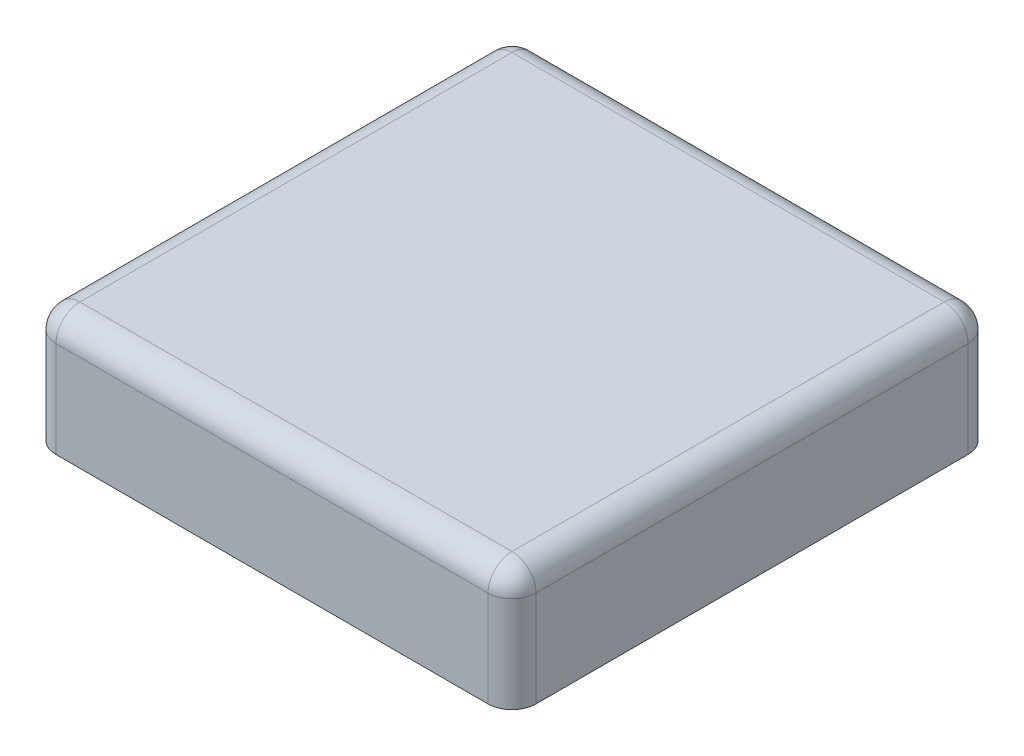
ISO-10303-21;
HEADER;
FILE_DESCRIPTION(('STEP AP214'),'2;1');
FILE_NAME('part.step','',(''),(''),'','','');
FILE_SCHEMA(('AUTOMOTIVE_DESIGN { 1 0 10303 214 1 1 1 1 }'));
ENDSEC;
DATA;
#1=APPLICATION_CONTEXT('core data for automotive mechanical design processes');
#2=APPLICATION_PROTOCOL_DEFINITION('international standard','automotive_design',2000,#1);
#3=PRODUCT_CONTEXT('',#1,'mechanical');
#4=PRODUCT('Part','Part','',(#3));
#5=PRODUCT_RELATED_PRODUCT_CATEGORY('part','',(#4));
#6=PRODUCT_DEFINITION_FORMATION('','',#4);
#7=PRODUCT_DEFINITION_CONTEXT('part definition',#1,'design');
#8=PRODUCT_DEFINITION('design','',#6,#7);
#9=PRODUCT_DEFINITION_SHAPE('','',#8);
#10=(LENGTH_UNIT() NAMED_UNIT(*) SI_UNIT(.MILLI.,.METRE.));
#11=(NAMED_UNIT(*) PLANE_ANGLE_UNIT() SI_UNIT($,.RADIAN.));
#12=(NAMED_UNIT(*) SI_UNIT($,.STERADIAN.) SOLID_ANGLE_UNIT());
#13=UNCERTAINTY_MEASURE_WITH_UNIT(LENGTH_MEASURE(1.E-05),#10,'distance_accuracy_value','');
#14=(GEOMETRIC_REPRESENTATION_CONTEXT(3) GLOBAL_UNCERTAINTY_ASSIGNED_CONTEXT((#13)) GLOBAL_UNIT_ASSIGNED_CONTEXT((#10,
#11,#12)) REPRESENTATION_CONTEXT('',''));
#15=CARTESIAN_POINT('',(0.,0.,0.));
#16=DIRECTION('',(0.,0.,1.));
#17=DIRECTION('',(1.,0.,0.));
#18=AXIS2_PLACEMENT_3D('',#15,#16,#17);
#19=CARTESIAN_POINT('',(30.,15.,-30.));
#20=DIRECTION('',(-1.,0.,0.));
#21=DIRECTION('',(0.,0.,1.));
#22=AXIS2_PLACEMENT_3D('',#19,#20,#21);
#23=PLANE('',#22);
#24=DIRECTION('',(0.,0.,-1.));
#25=VECTOR('',#24,1.);
#26=CARTESIAN_POINT('',(30.,0.,-30.));
#27=LINE('',#26,#25);
#28=CARTESIAN_POINT('',(30.,0.,27.));
#29=VERTEX_POINT('',#28);
#30=CARTESIAN_POINT('',(30.,0.,-27.));
#31=VERTEX_POINT('',#30);
#32=EDGE_CURVE('E194',#29,#31,#27,.T.);
#33=ORIENTED_EDGE('',*,*,#32,.T.);
#34=DIRECTION('',(0.,-1.,0.));
#35=VECTOR('',#34,1.);
#36=CARTESIAN_POINT('',(30.,15.,-27.));
#37=LINE('',#36,#35);
#38=CARTESIAN_POINT('',(30.,12.,-27.));
#39=VERTEX_POINT('',#38);
#40=EDGE_CURVE('E65',#31,#39,#37,.F.);
#41=ORIENTED_EDGE('',*,*,#40,.T.);
#42=DIRECTION('',(0.,0.,-1.));
#43=VECTOR('',#42,1.);
#44=CARTESIAN_POINT('',(30.,12.,30.));
#45=LINE('',#44,#43);
#46=CARTESIAN_POINT('',(30.,12.,27.));
#47=VERTEX_POINT('',#46);
#48=EDGE_CURVE('E253',#39,#47,#45,.F.);
#49=ORIENTED_EDGE('',*,*,#48,.T.);
#50=DIRECTION('',(0.,-1.,0.));
#51=VECTOR('',#50,1.);
#52=CARTESIAN_POINT('',(30.,15.,27.));
#53=LINE('',#52,#51);
#54=EDGE_CURVE('E250',#47,#29,#53,.T.);
#55=ORIENTED_EDGE('',*,*,#54,.T.);
#56=EDGE_LOOP('',(#33,#41,#49,#55));
#57=FACE_BOUND('',#56,.T.);
#58=ADVANCED_FACE('F39',(#57),#23,.F.);
#59=CARTESIAN_POINT('',(-30.,15.,-30.));
#60=DIRECTION('',(0.,0.,1.));
#61=DIRECTION('',(1.,0.,0.));
#62=AXIS2_PLACEMENT_3D('',#59,#60,#61);
#63=PLANE('',#62);
#64=DIRECTION('',(-1.,0.,0.));
#65=VECTOR('',#64,1.);
#66=CARTESIAN_POINT('',(30.,12.,-30.));
#67=LINE('',#66,#65);
#68=CARTESIAN_POINT('',(-27.,12.,-30.));
#69=VERTEX_POINT('',#68);
#70=CARTESIAN_POINT('',(27.,12.,-30.));
#71=VERTEX_POINT('',#70);
#72=EDGE_CURVE('E244',#69,#71,#67,.F.);
#73=ORIENTED_EDGE('',*,*,#72,.T.);
#74=DIRECTION('',(0.,-1.,0.));
#75=VECTOR('',#74,1.);
#76=CARTESIAN_POINT('',(27.,15.,-30.));
#77=LINE('',#76,#75);
#78=CARTESIAN_POINT('',(27.,0.,-30.));
#79=VERTEX_POINT('',#78);
#80=EDGE_CURVE('E247',#71,#79,#77,.T.);
#81=ORIENTED_EDGE('',*,*,#80,.T.);
#82=DIRECTION('',(-1.,0.,0.));
#83=VECTOR('',#82,1.);
#84=CARTESIAN_POINT('',(-30.,0.,-30.));
#85=LINE('',#84,#83);
#86=CARTESIAN_POINT('',(-27.,0.,-30.));
#87=VERTEX_POINT('',#86);
#88=EDGE_CURVE('E197',#79,#87,#85,.T.);
#89=ORIENTED_EDGE('',*,*,#88,.T.);
#90=DIRECTION('',(0.,-1.,0.));
#91=VECTOR('',#90,1.);
#92=CARTESIAN_POINT('',(-27.,15.,-30.));
#93=LINE('',#92,#91);
#94=EDGE_CURVE('E241',#87,#69,#93,.F.);
#95=ORIENTED_EDGE('',*,*,#94,.T.);
#96=EDGE_LOOP('',(#73,#81,#89,#95));
#97=FACE_BOUND('',#96,.T.);
#98=ADVANCED_FACE('F334',(#97),#63,.F.);
#99=CARTESIAN_POINT('',(-30.,15.,-30.));
#100=DIRECTION('',(1.,0.,0.));
#101=DIRECTION('',(0.,0.,-1.));
#102=AXIS2_PLACEMENT_3D('',#99,#100,#101);
#103=PLANE('',#102);
#104=DIRECTION('',(0.,0.,1.));
#105=VECTOR('',#104,1.);
#106=CARTESIAN_POINT('',(-30.,0.,-30.));
#107=LINE('',#106,#105);
#108=CARTESIAN_POINT('',(-30.,0.,-27.));
#109=VERTEX_POINT('',#108);
#110=CARTESIAN_POINT('',(-30.,0.,27.));
#111=VERTEX_POINT('',#110);
#112=EDGE_CURVE('E201',#109,#111,#107,.T.);
#113=ORIENTED_EDGE('',*,*,#112,.T.);
#114=DIRECTION('',(0.,-1.,0.));
#115=VECTOR('',#114,1.);
#116=CARTESIAN_POINT('',(-30.,15.,27.));
#117=LINE('',#116,#115);
#118=CARTESIAN_POINT('',(-30.,12.,27.));
#119=VERTEX_POINT('',#118);
#120=EDGE_CURVE('E238',#111,#119,#117,.F.);
#121=ORIENTED_EDGE('',*,*,#120,.T.);
#122=DIRECTION('',(0.,0.,1.));
#123=VECTOR('',#122,1.);
#124=CARTESIAN_POINT('',(-30.,12.,-30.));
#125=LINE('',#124,#123);
#126=CARTESIAN_POINT('',(-30.,12.,-27.));
#127=VERTEX_POINT('',#126);
#128=EDGE_CURVE('E235',#119,#127,#125,.F.);
#129=ORIENTED_EDGE('',*,*,#128,.T.);
#130=DIRECTION('',(0.,-1.,0.));
#131=VECTOR('',#130,1.);
#132=CARTESIAN_POINT('',(-30.,15.,-27.));
#133=LINE('',#132,#131);
#134=EDGE_CURVE('E232',#127,#109,#133,.T.);
#135=ORIENTED_EDGE('',*,*,#134,.T.);
#136=EDGE_LOOP('',(#113,#121,#129,#135));
#137=FACE_BOUND('',#136,.T.);
#138=ADVANCED_FACE('F369',(#137),#103,.F.);
#139=CARTESIAN_POINT('',(-30.,15.,30.));
#140=DIRECTION('',(0.,0.,-1.));
#141=DIRECTION('',(-1.,0.,0.));
#142=AXIS2_PLACEMENT_3D('',#139,#140,#141);
#143=PLANE('',#142);
#144=DIRECTION('',(1.,0.,0.));
#145=VECTOR('',#144,1.);
#146=CARTESIAN_POINT('',(-30.,0.,30.));
#147=LINE('',#146,#145);
#148=CARTESIAN_POINT('',(-27.,0.,30.));
#149=VERTEX_POINT('',#148);
#150=CARTESIAN_POINT('',(27.,0.,30.));
#151=VERTEX_POINT('',#150);
#152=EDGE_CURVE('E205',#149,#151,#147,.T.);
#153=ORIENTED_EDGE('',*,*,#152,.T.);
#154=DIRECTION('',(0.,-1.,0.));
#155=VECTOR('',#154,1.);
#156=CARTESIAN_POINT('',(27.,15.,30.));
#157=LINE('',#156,#155);
#158=CARTESIAN_POINT('',(27.,12.,30.));
#159=VERTEX_POINT('',#158);
#160=EDGE_CURVE('E229',#151,#159,#157,.F.);
#161=ORIENTED_EDGE('',*,*,#160,.T.);
#162=DIRECTION('',(1.,0.,0.));
#163=VECTOR('',#162,1.);
#164=CARTESIAN_POINT('',(-30.,12.,30.));
#165=LINE('',#164,#163);
#166=CARTESIAN_POINT('',(-27.,12.,30.));
#167=VERTEX_POINT('',#166);
#168=EDGE_CURVE('E225',#159,#167,#165,.F.);
#169=ORIENTED_EDGE('',*,*,#168,.T.);
#170=DIRECTION('',(0.,-1.,0.));
#171=VECTOR('',#170,1.);
#172=CARTESIAN_POINT('',(-27.,15.,30.));
#173=LINE('',#172,#171);
#174=EDGE_CURVE('E222',#167,#149,#173,.T.);
#175=ORIENTED_EDGE('',*,*,#174,.T.);
#176=EDGE_LOOP('',(#153,#161,#169,#175));
#177=FACE_BOUND('',#176,.T.);
#178=ADVANCED_FACE('F360',(#177),#143,.F.);
#179=CARTESIAN_POINT('',(0.,15.,0.));
#180=DIRECTION('',(0.,1.,0.));
#181=DIRECTION('',(0.,0.,1.));
#182=AXIS2_PLACEMENT_3D('',#179,#180,#181);
#183=PLANE('',#182);
#184=DIRECTION('',(0.,0.,1.));
#185=VECTOR('',#184,1.);
#186=CARTESIAN_POINT('',(-27.,15.,30.));
#187=LINE('',#186,#185);
#188=CARTESIAN_POINT('',(-27.,15.,-27.));
#189=VERTEX_POINT('',#188);
#190=CARTESIAN_POINT('',(-27.,15.,27.));
#191=VERTEX_POINT('',#190);
#192=EDGE_CURVE('E215',#189,#191,#187,.T.);
#193=ORIENTED_EDGE('',*,*,#192,.T.);
#194=DIRECTION('',(1.,0.,0.));
#195=VECTOR('',#194,1.);
#196=CARTESIAN_POINT('',(30.,15.,27.));
#197=LINE('',#196,#195);
#198=CARTESIAN_POINT('',(27.,15.,27.));
#199=VERTEX_POINT('',#198);
#200=EDGE_CURVE('E218',#191,#199,#197,.T.);
#201=ORIENTED_EDGE('',*,*,#200,.T.);
#202=DIRECTION('',(0.,0.,-1.));
#203=VECTOR('',#202,1.);
#204=CARTESIAN_POINT('',(27.,15.,-30.));
#205=LINE('',#204,#203);
#206=CARTESIAN_POINT('',(27.,15.,-27.));
#207=VERTEX_POINT('',#206);
#208=EDGE_CURVE('E209',#199,#207,#205,.T.);
#209=ORIENTED_EDGE('',*,*,#208,.T.);
#210=DIRECTION('',(-1.,0.,0.));
#211=VECTOR('',#210,1.);
#212=CARTESIAN_POINT('',(-30.,15.,-27.));
#213=LINE('',#212,#211);
#214=EDGE_CURVE('E212',#207,#189,#213,.T.);
#215=ORIENTED_EDGE('',*,*,#214,.T.);
#216=EDGE_LOOP('',(#193,#201,#209,#215));
#217=FACE_BOUND('',#216,.T.);
#218=ADVANCED_FACE('F324',(#217),#183,.T.);
#219=CARTESIAN_POINT('',(0.,0.,0.));
#220=DIRECTION('',(0.,1.,0.));
#221=DIRECTION('',(0.,0.,1.));
#222=AXIS2_PLACEMENT_3D('',#219,#220,#221);
#223=PLANE('',#222);
#224=DIRECTION('',(0.,0.,-1.));
#225=VECTOR('',#224,1.);
#226=CARTESIAN_POINT('',(27.,0.,-30.));
#227=LINE('',#226,#225);
#228=CARTESIAN_POINT('',(27.,0.,27.));
#229=VERTEX_POINT('',#228);
#230=CARTESIAN_POINT('',(27.,0.,-27.));
#231=VERTEX_POINT('',#230);
#232=EDGE_CURVE('E183',#229,#231,#227,.T.);
#233=ORIENTED_EDGE('',*,*,#232,.T.);
#234=DIRECTION('',(-1.,0.,0.));
#235=VECTOR('',#234,1.);
#236=CARTESIAN_POINT('',(-30.,0.,-27.));
#237=LINE('',#236,#235);
#238=CARTESIAN_POINT('',(-27.,0.,-27.));
#239=VERTEX_POINT('',#238);
#240=EDGE_CURVE('E150',#231,#239,#237,.T.);
#241=ORIENTED_EDGE('',*,*,#240,.T.);
#242=DIRECTION('',(0.,0.,1.));
#243=VECTOR('',#242,1.);
#244=CARTESIAN_POINT('',(-27.,0.,-30.));
#245=LINE('',#244,#243);
#246=CARTESIAN_POINT('',(-27.,0.,27.));
#247=VERTEX_POINT('',#246);
#248=EDGE_CURVE('E188',#239,#247,#245,.T.);
#249=ORIENTED_EDGE('',*,*,#248,.T.);
#250=DIRECTION('',(1.,0.,0.));
#251=VECTOR('',#250,1.);
#252=CARTESIAN_POINT('',(-30.,0.,27.));
#253=LINE('',#252,#251);
#254=EDGE_CURVE('E57',#247,#229,#253,.T.);
#255=ORIENTED_EDGE('',*,*,#254,.T.);
#256=EDGE_LOOP('',(#233,#241,#249,#255));
#257=FACE_BOUND('',#256,.T.);
#258=ORIENTED_EDGE('',*,*,#88,.F.);
#259=CARTESIAN_POINT('',(27.,0.,-27.));
#260=DIRECTION('',(0.,1.,0.));
#261=DIRECTION('',(0.,0.,1.));
#262=AXIS2_PLACEMENT_3D('',#259,#260,#261);
#263=CIRCLE('',#262,3.);
#264=EDGE_CURVE('E11',#79,#31,#263,.F.);
#265=ORIENTED_EDGE('',*,*,#264,.T.);
#266=ORIENTED_EDGE('',*,*,#32,.F.);
#267=CARTESIAN_POINT('',(27.,0.,27.));
#268=DIRECTION('',(0.,1.,0.));
#269=DIRECTION('',(0.,0.,1.));
#270=AXIS2_PLACEMENT_3D('',#267,#268,#269);
#271=CIRCLE('',#270,3.);
#272=EDGE_CURVE('E49',#29,#151,#271,.F.);
#273=ORIENTED_EDGE('',*,*,#272,.T.);
#274=ORIENTED_EDGE('',*,*,#152,.F.);
#275=CARTESIAN_POINT('',(-27.,0.,27.));
#276=DIRECTION('',(0.,1.,0.));
#277=DIRECTION('',(0.,0.,1.));
#278=AXIS2_PLACEMENT_3D('',#275,#276,#277);
#279=CIRCLE('',#278,3.);
#280=EDGE_CURVE('E261',#149,#111,#279,.F.);
#281=ORIENTED_EDGE('',*,*,#280,.T.);
#282=ORIENTED_EDGE('',*,*,#112,.F.);
#283=CARTESIAN_POINT('',(-27.,0.,-27.));
#284=DIRECTION('',(0.,1.,0.));
#285=DIRECTION('',(0.,0.,1.));
#286=AXIS2_PLACEMENT_3D('',#283,#284,#285);
#287=CIRCLE('',#286,3.);
#288=EDGE_CURVE('E258',#109,#87,#287,.F.);
#289=ORIENTED_EDGE('',*,*,#288,.T.);
#290=EDGE_LOOP('',(#258,#265,#266,#273,#274,#281,#282,#289));
#291=FACE_BOUND('',#290,.T.);
#292=ADVANCED_FACE('F342',(#257,#291),#223,.F.);
#293=CARTESIAN_POINT('',(-27.,15.,-27.));
#294=DIRECTION('',(0.,-1.,0.));
#295=DIRECTION('',(0.,0.,-1.));
#296=AXIS2_PLACEMENT_3D('',#293,#294,#295);
#297=CYLINDRICAL_SURFACE('',#296,3.);
#298=ORIENTED_EDGE('',*,*,#288,.F.);
#299=ORIENTED_EDGE('',*,*,#134,.F.);
#300=CARTESIAN_POINT('',(-27.,12.,-27.));
#301=DIRECTION('',(0.,1.,0.));
#302=DIRECTION('',(0.,0.,1.));
#303=AXIS2_PLACEMENT_3D('',#300,#301,#302);
#304=CIRCLE('',#303,3.);
#305=EDGE_CURVE('E43',#69,#127,#304,.T.);
#306=ORIENTED_EDGE('',*,*,#305,.F.);
#307=ORIENTED_EDGE('',*,*,#94,.F.);
#308=EDGE_LOOP('',(#298,#299,#306,#307));
#309=FACE_BOUND('',#308,.T.);
#310=ADVANCED_FACE('F41',(#309),#297,.T.);
#311=CARTESIAN_POINT('',(0.,12.,-27.));
#312=DIRECTION('',(1.,0.,0.));
#313=DIRECTION('',(0.,0.,-1.));
#314=AXIS2_PLACEMENT_3D('',#311,#312,#313);
#315=CYLINDRICAL_SURFACE('',#314,3.);
#316=CARTESIAN_POINT('',(27.,12.,-27.));
#317=DIRECTION('',(1.,0.,0.));
#318=DIRECTION('',(0.,0.,-1.));
#319=AXIS2_PLACEMENT_3D('',#316,#317,#318);
#320=CIRCLE('',#319,3.);
#321=EDGE_CURVE('E300',#71,#207,#320,.T.);
#322=ORIENTED_EDGE('',*,*,#321,.F.);
#323=ORIENTED_EDGE('',*,*,#72,.F.);
#324=CARTESIAN_POINT('',(-27.,12.,-27.));
#325=DIRECTION('',(-1.,0.,0.));
#326=DIRECTION('',(0.,0.,1.));
#327=AXIS2_PLACEMENT_3D('',#324,#325,#326);
#328=CIRCLE('',#327,3.);
#329=EDGE_CURVE('E303',#189,#69,#328,.T.);
#330=ORIENTED_EDGE('',*,*,#329,.F.);
#331=ORIENTED_EDGE('',*,*,#214,.F.);
#332=EDGE_LOOP('',(#322,#323,#330,#331));
#333=FACE_BOUND('',#332,.T.);
#334=ADVANCED_FACE('F331',(#333),#315,.T.);
#335=CARTESIAN_POINT('',(27.,15.,-27.));
#336=DIRECTION('',(0.,-1.,0.));
#337=DIRECTION('',(0.,0.,-1.));
#338=AXIS2_PLACEMENT_3D('',#335,#336,#337);
#339=CYLINDRICAL_SURFACE('',#338,3.);
#340=ORIENTED_EDGE('',*,*,#264,.F.);
#341=ORIENTED_EDGE('',*,*,#80,.F.);
#342=CARTESIAN_POINT('',(27.,12.,-27.));
#343=DIRECTION('',(0.,1.,0.));
#344=DIRECTION('',(0.,0.,1.));
#345=AXIS2_PLACEMENT_3D('',#342,#343,#344);
#346=CIRCLE('',#345,3.);
#347=EDGE_CURVE('E296',#39,#71,#346,.T.);
#348=ORIENTED_EDGE('',*,*,#347,.F.);
#349=ORIENTED_EDGE('',*,*,#40,.F.);
#350=EDGE_LOOP('',(#340,#341,#348,#349));
#351=FACE_BOUND('',#350,.T.);
#352=ADVANCED_FACE('F338',(#351),#339,.T.);
#353=CARTESIAN_POINT('',(-27.,12.,-27.));
#354=DIRECTION('',(0.,0.,1.));
#355=DIRECTION('',(1.,0.,0.));
#356=AXIS2_PLACEMENT_3D('',#353,#354,#355);
#357=SPHERICAL_SURFACE('',#356,3.);
#358=ORIENTED_EDGE('',*,*,#329,.T.);
#359=ORIENTED_EDGE('',*,*,#305,.T.);
#360=CARTESIAN_POINT('',(-27.,12.,-27.));
#361=DIRECTION('',(0.,0.,-1.));
#362=DIRECTION('',(-1.,0.,0.));
#363=AXIS2_PLACEMENT_3D('',#360,#361,#362);
#364=CIRCLE('',#363,3.);
#365=EDGE_CURVE('E292',#189,#127,#364,.F.);
#366=ORIENTED_EDGE('',*,*,#365,.F.);
#367=EDGE_LOOP('',(#358,#359,#366));
#368=FACE_BOUND('',#367,.T.);
#369=ADVANCED_FACE('F312',(#368),#357,.T.);
#370=CARTESIAN_POINT('',(27.,12.,-27.));
#371=DIRECTION('',(0.,0.,1.));
#372=DIRECTION('',(1.,0.,0.));
#373=AXIS2_PLACEMENT_3D('',#370,#371,#372);
#374=SPHERICAL_SURFACE('',#373,3.);
#375=ORIENTED_EDGE('',*,*,#347,.T.);
#376=ORIENTED_EDGE('',*,*,#321,.T.);
#377=CARTESIAN_POINT('',(27.,12.,-27.));
#378=DIRECTION('',(0.,0.,-1.));
#379=DIRECTION('',(-1.,0.,0.));
#380=AXIS2_PLACEMENT_3D('',#377,#378,#379);
#381=CIRCLE('',#380,3.);
#382=EDGE_CURVE('E288',#39,#207,#381,.F.);
#383=ORIENTED_EDGE('',*,*,#382,.F.);
#384=EDGE_LOOP('',(#375,#376,#383));
#385=FACE_BOUND('',#384,.T.);
#386=ADVANCED_FACE('F402',(#385),#374,.T.);
#387=CARTESIAN_POINT('',(-27.,15.,27.));
#388=DIRECTION('',(0.,-1.,0.));
#389=DIRECTION('',(0.,0.,-1.));
#390=AXIS2_PLACEMENT_3D('',#387,#388,#389);
#391=CYLINDRICAL_SURFACE('',#390,3.);
#392=ORIENTED_EDGE('',*,*,#280,.F.);
#393=ORIENTED_EDGE('',*,*,#174,.F.);
#394=CARTESIAN_POINT('',(-27.,12.,27.));
#395=DIRECTION('',(0.,1.,0.));
#396=DIRECTION('',(0.,0.,1.));
#397=AXIS2_PLACEMENT_3D('',#394,#395,#396);
#398=CIRCLE('',#397,3.);
#399=EDGE_CURVE('E284',#119,#167,#398,.T.);
#400=ORIENTED_EDGE('',*,*,#399,.F.);
#401=ORIENTED_EDGE('',*,*,#120,.F.);
#402=EDGE_LOOP('',(#392,#393,#400,#401));
#403=FACE_BOUND('',#402,.T.);
#404=ADVANCED_FACE('F367',(#403),#391,.T.);
#405=CARTESIAN_POINT('',(-27.,12.,0.));
#406=DIRECTION('',(0.,0.,-1.));
#407=DIRECTION('',(-1.,0.,0.));
#408=AXIS2_PLACEMENT_3D('',#405,#406,#407);
#409=CYLINDRICAL_SURFACE('',#408,3.);
#410=ORIENTED_EDGE('',*,*,#365,.T.);
#411=ORIENTED_EDGE('',*,*,#128,.F.);
#412=CARTESIAN_POINT('',(-27.,12.,27.));
#413=DIRECTION('',(0.,0.,1.));
#414=DIRECTION('',(1.,0.,0.));
#415=AXIS2_PLACEMENT_3D('',#412,#413,#414);
#416=CIRCLE('',#415,3.);
#417=EDGE_CURVE('E280',#191,#119,#416,.T.);
#418=ORIENTED_EDGE('',*,*,#417,.F.);
#419=ORIENTED_EDGE('',*,*,#192,.F.);
#420=EDGE_LOOP('',(#410,#411,#418,#419));
#421=FACE_BOUND('',#420,.T.);
#422=ADVANCED_FACE('F319',(#421),#409,.T.);
#423=CARTESIAN_POINT('',(27.,12.,0.));
#424=DIRECTION('',(0.,0.,1.));
#425=DIRECTION('',(1.,0.,0.));
#426=AXIS2_PLACEMENT_3D('',#423,#424,#425);
#427=CYLINDRICAL_SURFACE('',#426,3.);
#428=ORIENTED_EDGE('',*,*,#382,.T.);
#429=ORIENTED_EDGE('',*,*,#208,.F.);
#430=CARTESIAN_POINT('',(27.,12.,27.));
#431=DIRECTION('',(0.,0.,1.));
#432=DIRECTION('',(0.,-1.,0.));
#433=AXIS2_PLACEMENT_3D('',#430,#431,#432);
#434=CIRCLE('',#433,3.);
#435=EDGE_CURVE('E276',#47,#199,#434,.T.);
#436=ORIENTED_EDGE('',*,*,#435,.F.);
#437=ORIENTED_EDGE('',*,*,#48,.F.);
#438=EDGE_LOOP('',(#428,#429,#436,#437));
#439=FACE_BOUND('',#438,.T.);
#440=ADVANCED_FACE('F353',(#439),#427,.T.);
#441=CARTESIAN_POINT('',(27.,15.,27.));
#442=DIRECTION('',(0.,-1.,0.));
#443=DIRECTION('',(0.,0.,-1.));
#444=AXIS2_PLACEMENT_3D('',#441,#442,#443);
#445=CYLINDRICAL_SURFACE('',#444,3.);
#446=ORIENTED_EDGE('',*,*,#272,.F.);
#447=ORIENTED_EDGE('',*,*,#54,.F.);
#448=CARTESIAN_POINT('',(27.,12.,27.));
#449=DIRECTION('',(0.,1.,0.));
#450=DIRECTION('',(0.,0.,1.));
#451=AXIS2_PLACEMENT_3D('',#448,#449,#450);
#452=CIRCLE('',#451,3.);
#453=EDGE_CURVE('E272',#159,#47,#452,.T.);
#454=ORIENTED_EDGE('',*,*,#453,.F.);
#455=ORIENTED_EDGE('',*,*,#160,.F.);
#456=EDGE_LOOP('',(#446,#447,#454,#455));
#457=FACE_BOUND('',#456,.T.);
#458=ADVANCED_FACE('F349',(#457),#445,.T.);
#459=CARTESIAN_POINT('',(-27.,12.,27.));
#460=DIRECTION('',(0.,0.,1.));
#461=DIRECTION('',(1.,0.,0.));
#462=AXIS2_PLACEMENT_3D('',#459,#460,#461);
#463=SPHERICAL_SURFACE('',#462,3.);
#464=ORIENTED_EDGE('',*,*,#417,.T.);
#465=ORIENTED_EDGE('',*,*,#399,.T.);
#466=CARTESIAN_POINT('',(-27.,12.,27.));
#467=DIRECTION('',(-1.,0.,0.));
#468=DIRECTION('',(0.,0.,1.));
#469=AXIS2_PLACEMENT_3D('',#466,#467,#468);
#470=CIRCLE('',#469,3.);
#471=EDGE_CURVE('E269',#191,#167,#470,.F.);
#472=ORIENTED_EDGE('',*,*,#471,.F.);
#473=EDGE_LOOP('',(#464,#465,#472));
#474=FACE_BOUND('',#473,.T.);
#475=ADVANCED_FACE('F390',(#474),#463,.T.);
#476=CARTESIAN_POINT('',(27.,12.,27.));
#477=DIRECTION('',(0.,0.,1.));
#478=DIRECTION('',(1.,0.,0.));
#479=AXIS2_PLACEMENT_3D('',#476,#477,#478);
#480=SPHERICAL_SURFACE('',#479,3.);
#481=ORIENTED_EDGE('',*,*,#453,.T.);
#482=ORIENTED_EDGE('',*,*,#435,.T.);
#483=CARTESIAN_POINT('',(27.,12.,27.));
#484=DIRECTION('',(1.,0.,0.));
#485=DIRECTION('',(0.,0.,-1.));
#486=AXIS2_PLACEMENT_3D('',#483,#484,#485);
#487=CIRCLE('',#486,3.);
#488=EDGE_CURVE('E266',#159,#199,#487,.F.);
#489=ORIENTED_EDGE('',*,*,#488,.F.);
#490=EDGE_LOOP('',(#481,#482,#489));
#491=FACE_BOUND('',#490,.T.);
#492=ADVANCED_FACE('F356',(#491),#480,.T.);
#493=CARTESIAN_POINT('',(0.,12.,27.));
#494=DIRECTION('',(-1.,0.,0.));
#495=DIRECTION('',(0.,0.,1.));
#496=AXIS2_PLACEMENT_3D('',#493,#494,#495);
#497=CYLINDRICAL_SURFACE('',#496,3.);
#498=ORIENTED_EDGE('',*,*,#471,.T.);
#499=ORIENTED_EDGE('',*,*,#168,.F.);
#500=ORIENTED_EDGE('',*,*,#488,.T.);
#501=ORIENTED_EDGE('',*,*,#200,.F.);
#502=EDGE_LOOP('',(#498,#499,#500,#501));
#503=FACE_BOUND('',#502,.T.);
#504=ADVANCED_FACE('F358',(#503),#497,.T.);
#505=CARTESIAN_POINT('',(27.,15.,-30.));
#506=DIRECTION('',(-1.,0.,0.));
#507=DIRECTION('',(0.,0.,1.));
#508=AXIS2_PLACEMENT_3D('',#505,#506,#507);
#509=PLANE('',#508);
#510=ORIENTED_EDGE('',*,*,#232,.F.);
#511=DIRECTION('',(0.,-1.,0.));
#512=VECTOR('',#511,1.);
#513=CARTESIAN_POINT('',(27.,15.,27.));
#514=LINE('',#513,#512);
#515=CARTESIAN_POINT('',(27.,12.,27.));
#516=VERTEX_POINT('',#515);
#517=EDGE_CURVE('E155',#516,#229,#514,.T.);
#518=ORIENTED_EDGE('',*,*,#517,.F.);
#519=DIRECTION('',(0.,0.,-1.));
#520=VECTOR('',#519,1.);
#521=CARTESIAN_POINT('',(27.,12.,-30.));
#522=LINE('',#521,#520);
#523=CARTESIAN_POINT('',(27.,12.,-27.));
#524=VERTEX_POINT('',#523);
#525=EDGE_CURVE('E158',#516,#524,#522,.T.);
#526=ORIENTED_EDGE('',*,*,#525,.T.);
#527=DIRECTION('',(0.,-1.,0.));
#528=VECTOR('',#527,1.);
#529=CARTESIAN_POINT('',(27.,15.,-27.));
#530=LINE('',#529,#528);
#531=EDGE_CURVE('E143',#524,#231,#530,.T.);
#532=ORIENTED_EDGE('',*,*,#531,.T.);
#533=EDGE_LOOP('',(#510,#518,#526,#532));
#534=FACE_BOUND('',#533,.T.);
#535=ADVANCED_FACE('F159',(#534),#509,.T.);
#536=CARTESIAN_POINT('',(-30.,15.,-27.));
#537=DIRECTION('',(0.,0.,1.));
#538=DIRECTION('',(1.,0.,0.));
#539=AXIS2_PLACEMENT_3D('',#536,#537,#538);
#540=PLANE('',#539);
#541=DIRECTION('',(1.,0.,0.));
#542=VECTOR('',#541,1.);
#543=CARTESIAN_POINT('',(0.,12.,-27.));
#544=LINE('',#543,#542);
#545=CARTESIAN_POINT('',(-27.,12.,-27.));
#546=VERTEX_POINT('',#545);
#547=EDGE_CURVE('E147',#546,#524,#544,.T.);
#548=ORIENTED_EDGE('',*,*,#547,.F.);
#549=DIRECTION('',(0.,-1.,0.));
#550=VECTOR('',#549,1.);
#551=CARTESIAN_POINT('',(-27.,15.,-27.));
#552=LINE('',#551,#550);
#553=EDGE_CURVE('E172',#546,#239,#552,.T.);
#554=ORIENTED_EDGE('',*,*,#553,.T.);
#555=ORIENTED_EDGE('',*,*,#240,.F.);
#556=ORIENTED_EDGE('',*,*,#531,.F.);
#557=EDGE_LOOP('',(#548,#554,#555,#556));
#558=FACE_BOUND('',#557,.T.);
#559=ADVANCED_FACE('F145',(#558),#540,.T.);
#560=CARTESIAN_POINT('',(-27.,15.,-30.));
#561=DIRECTION('',(1.,0.,0.));
#562=DIRECTION('',(0.,0.,-1.));
#563=AXIS2_PLACEMENT_3D('',#560,#561,#562);
#564=PLANE('',#563);
#565=ORIENTED_EDGE('',*,*,#248,.F.);
#566=ORIENTED_EDGE('',*,*,#553,.F.);
#567=DIRECTION('',(0.,0.,-1.));
#568=VECTOR('',#567,1.);
#569=CARTESIAN_POINT('',(-27.,12.,0.));
#570=LINE('',#569,#568);
#571=CARTESIAN_POINT('',(-27.,12.,27.));
#572=VERTEX_POINT('',#571);
#573=EDGE_CURVE('E167',#572,#546,#570,.T.);
#574=ORIENTED_EDGE('',*,*,#573,.F.);
#575=DIRECTION('',(0.,-1.,0.));
#576=VECTOR('',#575,1.);
#577=CARTESIAN_POINT('',(-27.,15.,27.));
#578=LINE('',#577,#576);
#579=EDGE_CURVE('E164',#572,#247,#578,.T.);
#580=ORIENTED_EDGE('',*,*,#579,.T.);
#581=EDGE_LOOP('',(#565,#566,#574,#580));
#582=FACE_BOUND('',#581,.T.);
#583=ADVANCED_FACE('F462',(#582),#564,.T.);
#584=CARTESIAN_POINT('',(-30.,15.,27.));
#585=DIRECTION('',(0.,0.,-1.));
#586=DIRECTION('',(-1.,0.,0.));
#587=AXIS2_PLACEMENT_3D('',#584,#585,#586);
#588=PLANE('',#587);
#589=ORIENTED_EDGE('',*,*,#254,.F.);
#590=ORIENTED_EDGE('',*,*,#579,.F.);
#591=DIRECTION('',(-1.,0.,0.));
#592=VECTOR('',#591,1.);
#593=CARTESIAN_POINT('',(0.,12.,27.));
#594=LINE('',#593,#592);
#595=EDGE_CURVE('E178',#516,#572,#594,.T.);
#596=ORIENTED_EDGE('',*,*,#595,.F.);
#597=ORIENTED_EDGE('',*,*,#517,.T.);
#598=EDGE_LOOP('',(#589,#590,#596,#597));
#599=FACE_BOUND('',#598,.T.);
#600=ADVANCED_FACE('F469',(#599),#588,.T.);
#601=CARTESIAN_POINT('',(0.,12.,0.));
#602=DIRECTION('',(0.,1.,0.));
#603=DIRECTION('',(0.,0.,1.));
#604=AXIS2_PLACEMENT_3D('',#601,#602,#603);
#605=PLANE('',#604);
#606=ORIENTED_EDGE('',*,*,#573,.T.);
#607=ORIENTED_EDGE('',*,*,#547,.T.);
#608=ORIENTED_EDGE('',*,*,#525,.F.);
#609=ORIENTED_EDGE('',*,*,#595,.T.);
#610=EDGE_LOOP('',(#606,#607,#608,#609));
#611=FACE_BOUND('',#610,.T.);
#612=ADVANCED_FACE('F166',(#611),#605,.F.);
#613=CLOSED_SHELL('',(#58,#98,#138,#178,#218,#292,#310,#334,#352,#369,#386,#404,#422,#440,#458,
#475,#492,#504,#535,#559,#583,#600,#612));
#614=MANIFOLD_SOLID_BREP('B2',#613);
#615=ADVANCED_BREP_SHAPE_REPRESENTATION('',(#18,#614),#14);
#616=SHAPE_DEFINITION_REPRESENTATION(#9,#615);
ENDSEC;
END-ISO-10303-21;
